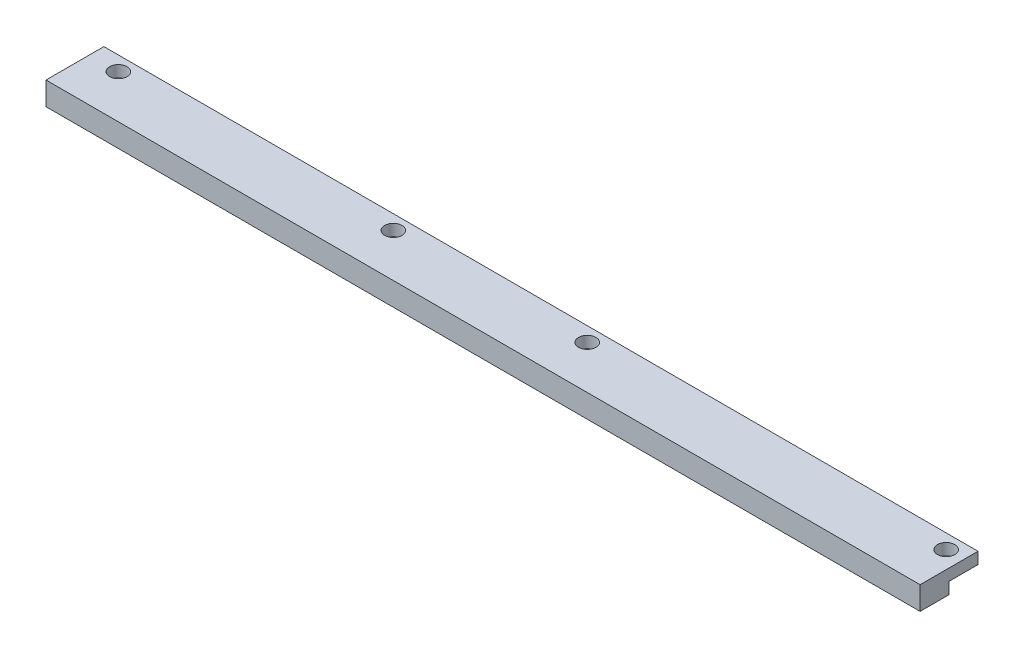
ISO-10303-21;
HEADER;
FILE_DESCRIPTION(('STEP AP214'),'2;1');
FILE_NAME('part.step','',(''),(''),'','','');
FILE_SCHEMA(('AUTOMOTIVE_DESIGN { 1 0 10303 214 1 1 1 1 }'));
ENDSEC;
DATA;
#1=APPLICATION_CONTEXT('core data for automotive mechanical design processes');
#2=APPLICATION_PROTOCOL_DEFINITION('international standard','automotive_design',2000,#1);
#3=PRODUCT_CONTEXT('',#1,'mechanical');
#4=PRODUCT('Part','Part','',(#3));
#5=PRODUCT_RELATED_PRODUCT_CATEGORY('part','',(#4));
#6=PRODUCT_DEFINITION_FORMATION('','',#4);
#7=PRODUCT_DEFINITION_CONTEXT('part definition',#1,'design');
#8=PRODUCT_DEFINITION('design','',#6,#7);
#9=PRODUCT_DEFINITION_SHAPE('','',#8);
#10=(LENGTH_UNIT() NAMED_UNIT(*) SI_UNIT(.MILLI.,.METRE.));
#11=(NAMED_UNIT(*) PLANE_ANGLE_UNIT() SI_UNIT($,.RADIAN.));
#12=(NAMED_UNIT(*) SI_UNIT($,.STERADIAN.) SOLID_ANGLE_UNIT());
#13=UNCERTAINTY_MEASURE_WITH_UNIT(LENGTH_MEASURE(1.E-05),#10,'distance_accuracy_value','');
#14=(GEOMETRIC_REPRESENTATION_CONTEXT(3) GLOBAL_UNCERTAINTY_ASSIGNED_CONTEXT((#13)) GLOBAL_UNIT_ASSIGNED_CONTEXT((#10,
#11,#12)) REPRESENTATION_CONTEXT('',''));
#15=CARTESIAN_POINT('',(0.,0.,0.));
#16=DIRECTION('',(0.,0.,1.));
#17=DIRECTION('',(1.,0.,0.));
#18=AXIS2_PLACEMENT_3D('',#15,#16,#17);
#19=CARTESIAN_POINT('',(0.,2.,0.));
#20=DIRECTION('',(0.,-1.,0.));
#21=DIRECTION('',(0.,0.,-1.));
#22=AXIS2_PLACEMENT_3D('',#19,#20,#21);
#23=PLANE('',#22);
#24=DIRECTION('',(0.,0.,-1.));
#25=VECTOR('',#24,1.);
#26=CARTESIAN_POINT('',(0.,2.,5.));
#27=LINE('',#26,#25);
#28=CARTESIAN_POINT('',(0.,2.,10.));
#29=VERTEX_POINT('',#28);
#30=CARTESIAN_POINT('',(0.,2.,0.));
#31=VERTEX_POINT('',#30);
#32=EDGE_CURVE('E142',#29,#31,#27,.T.);
#33=ORIENTED_EDGE('',*,*,#32,.F.);
#34=DIRECTION('',(1.,0.,0.));
#35=VECTOR('',#34,1.);
#36=CARTESIAN_POINT('',(0.,2.,10.));
#37=LINE('',#36,#35);
#38=CARTESIAN_POINT('',(151.,2.,10.));
#39=VERTEX_POINT('',#38);
#40=EDGE_CURVE('E214',#29,#39,#37,.T.);
#41=ORIENTED_EDGE('',*,*,#40,.T.);
#42=DIRECTION('',(0.,0.,-1.));
#43=VECTOR('',#42,1.);
#44=CARTESIAN_POINT('',(151.,2.,5.));
#45=LINE('',#44,#43);
#46=CARTESIAN_POINT('',(151.,2.,0.));
#47=VERTEX_POINT('',#46);
#48=EDGE_CURVE('E112',#39,#47,#45,.T.);
#49=ORIENTED_EDGE('',*,*,#48,.T.);
#50=DIRECTION('',(1.,0.,0.));
#51=VECTOR('',#50,1.);
#52=CARTESIAN_POINT('',(0.,2.,0.));
#53=LINE('',#52,#51);
#54=EDGE_CURVE('E194',#31,#47,#53,.T.);
#55=ORIENTED_EDGE('',*,*,#54,.F.);
#56=EDGE_LOOP('',(#33,#41,#49,#55));
#57=FACE_BOUND('',#56,.T.);
#58=CARTESIAN_POINT('',(5.,2.,2.5));
#59=DIRECTION('',(0.,1.,0.));
#60=DIRECTION('',(0.,0.,1.));
#61=AXIS2_PLACEMENT_3D('',#58,#59,#60);
#62=CIRCLE('',#61,1.5);
#63=CARTESIAN_POINT('',(5.,2.,4.));
#64=VERTEX_POINT('',#63);
#65=EDGE_CURVE('E152',#64,#64,#62,.T.);
#66=ORIENTED_EDGE('',*,*,#65,.F.);
#67=EDGE_LOOP('',(#66));
#68=FACE_BOUND('',#67,.T.);
#69=CARTESIAN_POINT('',(52.5,2.,2.49999999999999));
#70=DIRECTION('',(0.,1.,0.));
#71=DIRECTION('',(0.,0.,1.));
#72=AXIS2_PLACEMENT_3D('',#69,#70,#71);
#73=CIRCLE('',#72,1.5);
#74=CARTESIAN_POINT('',(52.5,2.,3.99999999999999));
#75=VERTEX_POINT('',#74);
#76=EDGE_CURVE('E183',#75,#75,#73,.T.);
#77=ORIENTED_EDGE('',*,*,#76,.F.);
#78=EDGE_LOOP('',(#77));
#79=FACE_BOUND('',#78,.T.);
#80=CARTESIAN_POINT('',(86.,2.,2.5));
#81=DIRECTION('',(0.,1.,0.));
#82=DIRECTION('',(0.,0.,1.));
#83=AXIS2_PLACEMENT_3D('',#80,#81,#82);
#84=CIRCLE('',#83,1.5);
#85=CARTESIAN_POINT('',(86.,2.,4.));
#86=VERTEX_POINT('',#85);
#87=EDGE_CURVE('E177',#86,#86,#84,.T.);
#88=ORIENTED_EDGE('',*,*,#87,.F.);
#89=EDGE_LOOP('',(#88));
#90=FACE_BOUND('',#89,.T.);
#91=CARTESIAN_POINT('',(148.,2.,2.50000000000002));
#92=DIRECTION('',(0.,1.,0.));
#93=DIRECTION('',(0.,0.,1.));
#94=AXIS2_PLACEMENT_3D('',#91,#92,#93);
#95=CIRCLE('',#94,1.5);
#96=CARTESIAN_POINT('',(148.,2.,4.00000000000001));
#97=VERTEX_POINT('',#96);
#98=EDGE_CURVE('E169',#97,#97,#95,.T.);
#99=ORIENTED_EDGE('',*,*,#98,.F.);
#100=EDGE_LOOP('',(#99));
#101=FACE_BOUND('',#100,.T.);
#102=ADVANCED_FACE('F95',(#57,#68,#79,#90,#101),#23,.F.);
#103=CARTESIAN_POINT('',(0.,0.,0.));
#104=DIRECTION('',(0.,-1.,0.));
#105=DIRECTION('',(0.,0.,-1.));
#106=AXIS2_PLACEMENT_3D('',#103,#104,#105);
#107=PLANE('',#106);
#108=CARTESIAN_POINT('',(86.,0.,2.5));
#109=DIRECTION('',(0.,1.,0.));
#110=DIRECTION('',(0.,0.,1.));
#111=AXIS2_PLACEMENT_3D('',#108,#109,#110);
#112=CIRCLE('',#111,1.5);
#113=CARTESIAN_POINT('',(86.,0.,4.));
#114=VERTEX_POINT('',#113);
#115=EDGE_CURVE('E172',#114,#114,#112,.T.);
#116=ORIENTED_EDGE('',*,*,#115,.T.);
#117=EDGE_LOOP('',(#116));
#118=FACE_BOUND('',#117,.T.);
#119=CARTESIAN_POINT('',(5.,0.,2.5));
#120=DIRECTION('',(0.,1.,0.));
#121=DIRECTION('',(0.,0.,1.));
#122=AXIS2_PLACEMENT_3D('',#119,#120,#121);
#123=CIRCLE('',#122,1.5);
#124=CARTESIAN_POINT('',(5.,0.,4.));
#125=VERTEX_POINT('',#124);
#126=EDGE_CURVE('E186',#125,#125,#123,.T.);
#127=ORIENTED_EDGE('',*,*,#126,.T.);
#128=EDGE_LOOP('',(#127));
#129=FACE_BOUND('',#128,.T.);
#130=DIRECTION('',(0.,0.,-1.));
#131=VECTOR('',#130,1.);
#132=CARTESIAN_POINT('',(0.,0.,5.));
#133=LINE('',#132,#131);
#134=CARTESIAN_POINT('',(0.,0.,5.));
#135=VERTEX_POINT('',#134);
#136=CARTESIAN_POINT('',(0.,0.,0.));
#137=VERTEX_POINT('',#136);
#138=EDGE_CURVE('E136',#135,#137,#133,.T.);
#139=ORIENTED_EDGE('',*,*,#138,.T.);
#140=DIRECTION('',(1.,0.,0.));
#141=VECTOR('',#140,1.);
#142=CARTESIAN_POINT('',(0.,0.,0.));
#143=LINE('',#142,#141);
#144=CARTESIAN_POINT('',(151.,0.,0.));
#145=VERTEX_POINT('',#144);
#146=EDGE_CURVE('E151',#137,#145,#143,.T.);
#147=ORIENTED_EDGE('',*,*,#146,.T.);
#148=DIRECTION('',(0.,0.,-1.));
#149=VECTOR('',#148,1.);
#150=CARTESIAN_POINT('',(151.,0.,5.));
#151=LINE('',#150,#149);
#152=CARTESIAN_POINT('',(151.,0.,5.));
#153=VERTEX_POINT('',#152);
#154=EDGE_CURVE('E137',#153,#145,#151,.T.);
#155=ORIENTED_EDGE('',*,*,#154,.F.);
#156=DIRECTION('',(1.,0.,0.));
#157=VECTOR('',#156,1.);
#158=CARTESIAN_POINT('',(0.,0.,5.));
#159=LINE('',#158,#157);
#160=EDGE_CURVE('E131',#135,#153,#159,.T.);
#161=ORIENTED_EDGE('',*,*,#160,.F.);
#162=EDGE_LOOP('',(#139,#147,#155,#161));
#163=FACE_BOUND('',#162,.T.);
#164=CARTESIAN_POINT('',(52.5,0.,2.49999999999999));
#165=DIRECTION('',(0.,1.,0.));
#166=DIRECTION('',(0.,0.,1.));
#167=AXIS2_PLACEMENT_3D('',#164,#165,#166);
#168=CIRCLE('',#167,1.5);
#169=CARTESIAN_POINT('',(52.5,0.,3.99999999999999));
#170=VERTEX_POINT('',#169);
#171=EDGE_CURVE('E180',#170,#170,#168,.T.);
#172=ORIENTED_EDGE('',*,*,#171,.T.);
#173=EDGE_LOOP('',(#172));
#174=FACE_BOUND('',#173,.T.);
#175=CARTESIAN_POINT('',(148.,0.,2.50000000000002));
#176=DIRECTION('',(0.,1.,0.));
#177=DIRECTION('',(0.,0.,1.));
#178=AXIS2_PLACEMENT_3D('',#175,#176,#177);
#179=CIRCLE('',#178,1.5);
#180=CARTESIAN_POINT('',(148.,0.,4.00000000000001));
#181=VERTEX_POINT('',#180);
#182=EDGE_CURVE('E173',#181,#181,#179,.T.);
#183=ORIENTED_EDGE('',*,*,#182,.T.);
#184=EDGE_LOOP('',(#183));
#185=FACE_BOUND('',#184,.T.);
#186=ADVANCED_FACE('F133',(#118,#129,#163,#174,#185),#107,.T.);
#187=CARTESIAN_POINT('',(0.,2.,5.));
#188=DIRECTION('',(-1.,0.,0.));
#189=DIRECTION('',(0.,0.,1.));
#190=AXIS2_PLACEMENT_3D('',#187,#188,#189);
#191=PLANE('',#190);
#192=ORIENTED_EDGE('',*,*,#138,.F.);
#193=DIRECTION('',(0.,1.,0.));
#194=VECTOR('',#193,1.);
#195=CARTESIAN_POINT('',(0.,-2.,5.));
#196=LINE('',#195,#194);
#197=CARTESIAN_POINT('',(0.,-2.,5.));
#198=VERTEX_POINT('',#197);
#199=EDGE_CURVE('E148',#198,#135,#196,.T.);
#200=ORIENTED_EDGE('',*,*,#199,.F.);
#201=DIRECTION('',(0.,0.,1.));
#202=VECTOR('',#201,1.);
#203=CARTESIAN_POINT('',(0.,-2.,0.));
#204=LINE('',#203,#202);
#205=CARTESIAN_POINT('',(0.,-2.,10.));
#206=VERTEX_POINT('',#205);
#207=EDGE_CURVE('E207',#198,#206,#204,.T.);
#208=ORIENTED_EDGE('',*,*,#207,.T.);
#209=DIRECTION('',(0.,1.,0.));
#210=VECTOR('',#209,1.);
#211=CARTESIAN_POINT('',(0.,-2.,10.));
#212=LINE('',#211,#210);
#213=EDGE_CURVE('E158',#206,#29,#212,.T.);
#214=ORIENTED_EDGE('',*,*,#213,.T.);
#215=ORIENTED_EDGE('',*,*,#32,.T.);
#216=DIRECTION('',(0.,-1.,0.));
#217=VECTOR('',#216,1.);
#218=CARTESIAN_POINT('',(0.,2.,0.));
#219=LINE('',#218,#217);
#220=EDGE_CURVE('E99',#31,#137,#219,.T.);
#221=ORIENTED_EDGE('',*,*,#220,.T.);
#222=EDGE_LOOP('',(#192,#200,#208,#214,#215,#221));
#223=FACE_BOUND('',#222,.T.);
#224=ADVANCED_FACE('F97',(#223),#191,.T.);
#225=CARTESIAN_POINT('',(151.,2.,5.));
#226=DIRECTION('',(-1.,0.,0.));
#227=DIRECTION('',(0.,0.,1.));
#228=AXIS2_PLACEMENT_3D('',#225,#226,#227);
#229=PLANE('',#228);
#230=ORIENTED_EDGE('',*,*,#154,.T.);
#231=DIRECTION('',(0.,-1.,0.));
#232=VECTOR('',#231,1.);
#233=CARTESIAN_POINT('',(151.,2.,0.));
#234=LINE('',#233,#232);
#235=EDGE_CURVE('E12',#47,#145,#234,.T.);
#236=ORIENTED_EDGE('',*,*,#235,.F.);
#237=ORIENTED_EDGE('',*,*,#48,.F.);
#238=DIRECTION('',(0.,1.,0.));
#239=VECTOR('',#238,1.);
#240=CARTESIAN_POINT('',(151.,-2.,10.));
#241=LINE('',#240,#239);
#242=CARTESIAN_POINT('',(151.,-2.,10.));
#243=VERTEX_POINT('',#242);
#244=EDGE_CURVE('E162',#243,#39,#241,.T.);
#245=ORIENTED_EDGE('',*,*,#244,.F.);
#246=DIRECTION('',(0.,0.,-1.));
#247=VECTOR('',#246,1.);
#248=CARTESIAN_POINT('',(151.,-2.,-8.38218383591993E-13));
#249=LINE('',#248,#247);
#250=CARTESIAN_POINT('',(151.,-2.,5.));
#251=VERTEX_POINT('',#250);
#252=EDGE_CURVE('E159',#243,#251,#249,.T.);
#253=ORIENTED_EDGE('',*,*,#252,.T.);
#254=DIRECTION('',(0.,1.,0.));
#255=VECTOR('',#254,1.);
#256=CARTESIAN_POINT('',(151.,-2.,5.));
#257=LINE('',#256,#255);
#258=EDGE_CURVE('E176',#251,#153,#257,.T.);
#259=ORIENTED_EDGE('',*,*,#258,.T.);
#260=EDGE_LOOP('',(#230,#236,#237,#245,#253,#259));
#261=FACE_BOUND('',#260,.T.);
#262=ADVANCED_FACE('F199',(#261),#229,.F.);
#263=CARTESIAN_POINT('',(0.,2.,0.));
#264=DIRECTION('',(0.,0.,-1.));
#265=DIRECTION('',(-1.,0.,0.));
#266=AXIS2_PLACEMENT_3D('',#263,#264,#265);
#267=PLANE('',#266);
#268=ORIENTED_EDGE('',*,*,#146,.F.);
#269=ORIENTED_EDGE('',*,*,#220,.F.);
#270=ORIENTED_EDGE('',*,*,#54,.T.);
#271=ORIENTED_EDGE('',*,*,#235,.T.);
#272=EDGE_LOOP('',(#268,#269,#270,#271));
#273=FACE_BOUND('',#272,.T.);
#274=ADVANCED_FACE('F200',(#273),#267,.T.);
#275=CARTESIAN_POINT('',(5.,2.,2.5));
#276=DIRECTION('',(0.,-1.,0.));
#277=DIRECTION('',(0.,0.,-1.));
#278=AXIS2_PLACEMENT_3D('',#275,#276,#277);
#279=CYLINDRICAL_SURFACE('',#278,1.5);
#280=ORIENTED_EDGE('',*,*,#65,.T.);
#281=EDGE_LOOP('',(#280));
#282=FACE_BOUND('',#281,.T.);
#283=ORIENTED_EDGE('',*,*,#126,.F.);
#284=EDGE_LOOP('',(#283));
#285=FACE_BOUND('',#284,.T.);
#286=ADVANCED_FACE('F248',(#282,#285),#279,.F.);
#287=CARTESIAN_POINT('',(52.5,2.,2.49999999999999));
#288=DIRECTION('',(0.,-1.,0.));
#289=DIRECTION('',(0.,0.,-1.));
#290=AXIS2_PLACEMENT_3D('',#287,#288,#289);
#291=CYLINDRICAL_SURFACE('',#290,1.5);
#292=ORIENTED_EDGE('',*,*,#76,.T.);
#293=EDGE_LOOP('',(#292));
#294=FACE_BOUND('',#293,.T.);
#295=ORIENTED_EDGE('',*,*,#171,.F.);
#296=EDGE_LOOP('',(#295));
#297=FACE_BOUND('',#296,.T.);
#298=ADVANCED_FACE('F257',(#294,#297),#291,.F.);
#299=CARTESIAN_POINT('',(86.,2.,2.5));
#300=DIRECTION('',(0.,-1.,0.));
#301=DIRECTION('',(0.,0.,-1.));
#302=AXIS2_PLACEMENT_3D('',#299,#300,#301);
#303=CYLINDRICAL_SURFACE('',#302,1.5);
#304=ORIENTED_EDGE('',*,*,#87,.T.);
#305=EDGE_LOOP('',(#304));
#306=FACE_BOUND('',#305,.T.);
#307=ORIENTED_EDGE('',*,*,#115,.F.);
#308=EDGE_LOOP('',(#307));
#309=FACE_BOUND('',#308,.T.);
#310=ADVANCED_FACE('F262',(#306,#309),#303,.F.);
#311=CARTESIAN_POINT('',(148.,2.,2.50000000000002));
#312=DIRECTION('',(0.,-1.,0.));
#313=DIRECTION('',(0.,0.,-1.));
#314=AXIS2_PLACEMENT_3D('',#311,#312,#313);
#315=CYLINDRICAL_SURFACE('',#314,1.5);
#316=ORIENTED_EDGE('',*,*,#98,.T.);
#317=EDGE_LOOP('',(#316));
#318=FACE_BOUND('',#317,.T.);
#319=ORIENTED_EDGE('',*,*,#182,.F.);
#320=EDGE_LOOP('',(#319));
#321=FACE_BOUND('',#320,.T.);
#322=ADVANCED_FACE('F275',(#318,#321),#315,.F.);
#323=CARTESIAN_POINT('',(0.,-2.,5.));
#324=DIRECTION('',(0.,0.,-1.));
#325=DIRECTION('',(-1.,0.,0.));
#326=AXIS2_PLACEMENT_3D('',#323,#324,#325);
#327=PLANE('',#326);
#328=ORIENTED_EDGE('',*,*,#199,.T.);
#329=ORIENTED_EDGE('',*,*,#160,.T.);
#330=ORIENTED_EDGE('',*,*,#258,.F.);
#331=DIRECTION('',(-1.,0.,0.));
#332=VECTOR('',#331,1.);
#333=CARTESIAN_POINT('',(0.,-2.,5.));
#334=LINE('',#333,#332);
#335=EDGE_CURVE('E157',#251,#198,#334,.T.);
#336=ORIENTED_EDGE('',*,*,#335,.T.);
#337=EDGE_LOOP('',(#328,#329,#330,#336));
#338=FACE_BOUND('',#337,.T.);
#339=ADVANCED_FACE('F155',(#338),#327,.T.);
#340=CARTESIAN_POINT('',(0.,-2.,10.));
#341=DIRECTION('',(0.,0.,1.));
#342=DIRECTION('',(1.,0.,0.));
#343=AXIS2_PLACEMENT_3D('',#340,#341,#342);
#344=PLANE('',#343);
#345=ORIENTED_EDGE('',*,*,#40,.F.);
#346=ORIENTED_EDGE('',*,*,#213,.F.);
#347=DIRECTION('',(1.,0.,0.));
#348=VECTOR('',#347,1.);
#349=CARTESIAN_POINT('',(0.,-2.,10.));
#350=LINE('',#349,#348);
#351=EDGE_CURVE('E165',#206,#243,#350,.T.);
#352=ORIENTED_EDGE('',*,*,#351,.T.);
#353=ORIENTED_EDGE('',*,*,#244,.T.);
#354=EDGE_LOOP('',(#345,#346,#352,#353));
#355=FACE_BOUND('',#354,.T.);
#356=ADVANCED_FACE('F215',(#355),#344,.T.);
#357=CARTESIAN_POINT('',(0.,-2.,0.));
#358=DIRECTION('',(0.,1.,0.));
#359=DIRECTION('',(0.,0.,1.));
#360=AXIS2_PLACEMENT_3D('',#357,#358,#359);
#361=PLANE('',#360);
#362=ORIENTED_EDGE('',*,*,#335,.F.);
#363=ORIENTED_EDGE('',*,*,#252,.F.);
#364=ORIENTED_EDGE('',*,*,#351,.F.);
#365=ORIENTED_EDGE('',*,*,#207,.F.);
#366=EDGE_LOOP('',(#362,#363,#364,#365));
#367=FACE_BOUND('',#366,.T.);
#368=ADVANCED_FACE('F227',(#367),#361,.F.);
#369=CLOSED_SHELL('',(#102,#186,#224,#262,#274,#286,#298,#310,#322,#339,#356,#368));
#370=MANIFOLD_SOLID_BREP('B2',#369);
#371=ADVANCED_BREP_SHAPE_REPRESENTATION('',(#18,#370),#14);
#372=SHAPE_DEFINITION_REPRESENTATION(#9,#371);
ENDSEC;
END-ISO-10303-21;
